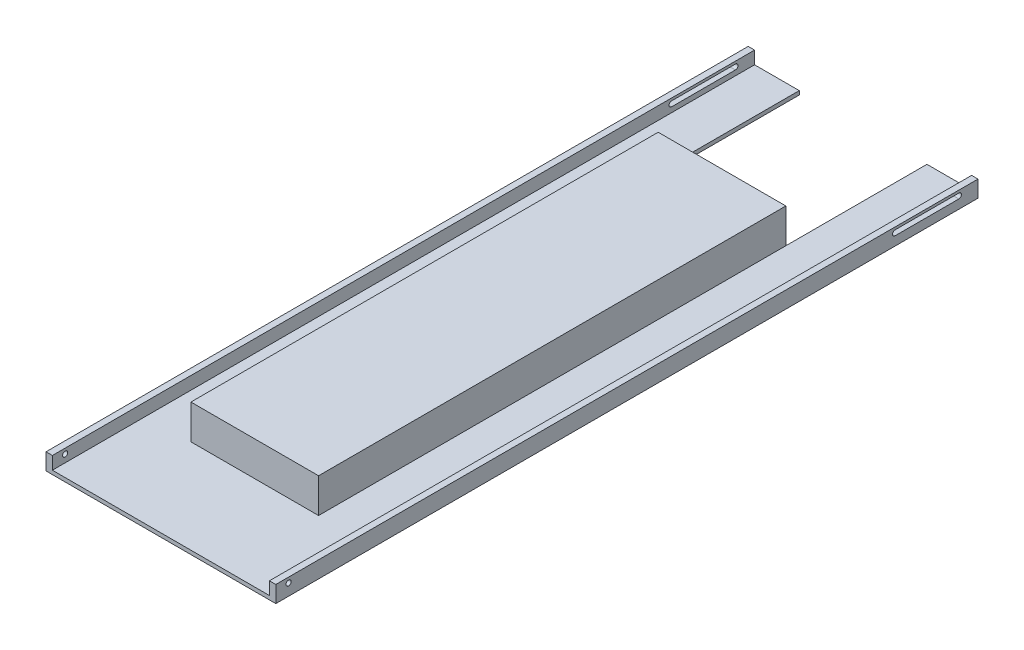
ISO-10303-21;
HEADER;
FILE_DESCRIPTION(('STEP AP214'),'2;1');
FILE_NAME('part.step','',(''),(''),'','','');
FILE_SCHEMA(('AUTOMOTIVE_DESIGN { 1 0 10303 214 1 1 1 1 }'));
ENDSEC;
DATA;
#1=APPLICATION_CONTEXT('core data for automotive mechanical design processes');
#2=APPLICATION_PROTOCOL_DEFINITION('international standard','automotive_design',2000,#1);
#3=PRODUCT_CONTEXT('',#1,'mechanical');
#4=PRODUCT('Part','Part','',(#3));
#5=PRODUCT_RELATED_PRODUCT_CATEGORY('part','',(#4));
#6=PRODUCT_DEFINITION_FORMATION('','',#4);
#7=PRODUCT_DEFINITION_CONTEXT('part definition',#1,'design');
#8=PRODUCT_DEFINITION('design','',#6,#7);
#9=PRODUCT_DEFINITION_SHAPE('','',#8);
#10=(LENGTH_UNIT() NAMED_UNIT(*) SI_UNIT(.MILLI.,.METRE.));
#11=(NAMED_UNIT(*) PLANE_ANGLE_UNIT() SI_UNIT($,.RADIAN.));
#12=(NAMED_UNIT(*) SI_UNIT($,.STERADIAN.) SOLID_ANGLE_UNIT());
#13=UNCERTAINTY_MEASURE_WITH_UNIT(LENGTH_MEASURE(1.E-05),#10,'distance_accuracy_value','');
#14=(GEOMETRIC_REPRESENTATION_CONTEXT(3) GLOBAL_UNCERTAINTY_ASSIGNED_CONTEXT((#13)) GLOBAL_UNIT_ASSIGNED_CONTEXT((#10,
#11,#12)) REPRESENTATION_CONTEXT('',''));
#15=CARTESIAN_POINT('',(0.,0.,0.));
#16=DIRECTION('',(0.,0.,1.));
#17=DIRECTION('',(1.,0.,0.));
#18=AXIS2_PLACEMENT_3D('',#15,#16,#17);
#19=CARTESIAN_POINT('',(-25.6470588235294,7.85294117647059,474.5));
#20=DIRECTION('',(0.,0.,1.));
#21=DIRECTION('',(1.,0.,0.));
#22=AXIS2_PLACEMENT_3D('',#19,#20,#21);
#23=PLANE('',#22);
#24=DIRECTION('',(0.,1.,0.));
#25=VECTOR('',#24,1.);
#26=CARTESIAN_POINT('',(-27.6470588235294,-9.14705882352941,474.5));
#27=LINE('',#26,#25);
#28=CARTESIAN_POINT('',(-27.6470588235294,-9.14705882352941,474.5));
#29=VERTEX_POINT('',#28);
#30=CARTESIAN_POINT('',(-27.6470588235294,18.8529411764706,474.5));
#31=VERTEX_POINT('',#30);
#32=EDGE_CURVE('E246',#29,#31,#27,.T.);
#33=ORIENTED_EDGE('',*,*,#32,.F.);
#34=DIRECTION('',(1.,0.,0.));
#35=VECTOR('',#34,1.);
#36=CARTESIAN_POINT('',(-125.647058823529,-9.14705882352941,474.5));
#37=LINE('',#36,#35);
#38=CARTESIAN_POINT('',(-123.647058823529,-9.14705882352941,474.5));
#39=VERTEX_POINT('',#38);
#40=EDGE_CURVE('E234',#39,#29,#37,.T.);
#41=ORIENTED_EDGE('',*,*,#40,.F.);
#42=DIRECTION('',(0.,-1.,0.));
#43=VECTOR('',#42,1.);
#44=CARTESIAN_POINT('',(-123.647058823529,-9.14705882352941,474.5));
#45=LINE('',#44,#43);
#46=CARTESIAN_POINT('',(-123.647058823529,18.8529411764706,474.5));
#47=VERTEX_POINT('',#46);
#48=EDGE_CURVE('E245',#47,#39,#45,.T.);
#49=ORIENTED_EDGE('',*,*,#48,.F.);
#50=DIRECTION('',(-1.,0.,0.));
#51=VECTOR('',#50,1.);
#52=CARTESIAN_POINT('',(-125.647058823529,18.8529411764706,474.5));
#53=LINE('',#52,#51);
#54=EDGE_CURVE('E375',#31,#47,#53,.T.);
#55=ORIENTED_EDGE('',*,*,#54,.F.);
#56=EDGE_LOOP('',(#33,#41,#49,#55));
#57=FACE_BOUND('',#56,.T.);
#58=ADVANCED_FACE('F39',(#57),#23,.F.);
#59=CARTESIAN_POINT('',(-125.647058823529,18.8529411764706,110.5));
#60=DIRECTION('',(0.,1.,0.));
#61=DIRECTION('',(-1.,0.,0.));
#62=AXIS2_PLACEMENT_3D('',#59,#60,#61);
#63=PLANE('',#62);
#64=DIRECTION('',(0.,0.,1.));
#65=VECTOR('',#64,1.);
#66=CARTESIAN_POINT('',(-27.6470588235294,18.8529411764706,82.4286623047636));
#67=LINE('',#66,#65);
#68=CARTESIAN_POINT('',(-27.6470588235294,18.8529411764706,110.5));
#69=VERTEX_POINT('',#68);
#70=EDGE_CURVE('E55',#69,#31,#67,.T.);
#71=ORIENTED_EDGE('',*,*,#70,.T.);
#72=ORIENTED_EDGE('',*,*,#54,.T.);
#73=DIRECTION('',(0.,0.,1.));
#74=VECTOR('',#73,1.);
#75=CARTESIAN_POINT('',(-123.647058823529,18.8529411764706,82.4286623047636));
#76=LINE('',#75,#74);
#77=CARTESIAN_POINT('',(-123.647058823529,18.8529411764706,110.5));
#78=VERTEX_POINT('',#77);
#79=EDGE_CURVE('E267',#78,#47,#76,.T.);
#80=ORIENTED_EDGE('',*,*,#79,.F.);
#81=DIRECTION('',(-1.,0.,0.));
#82=VECTOR('',#81,1.);
#83=CARTESIAN_POINT('',(-125.647058823529,18.8529411764706,110.5));
#84=LINE('',#83,#82);
#85=EDGE_CURVE('E60',#69,#78,#84,.T.);
#86=ORIENTED_EDGE('',*,*,#85,.F.);
#87=EDGE_LOOP('',(#71,#72,#80,#86));
#88=FACE_BOUND('',#87,.T.);
#89=ADVANCED_FACE('F559',(#88),#63,.F.);
#90=CARTESIAN_POINT('',(-25.6470588235294,7.85294117647059,474.5));
#91=DIRECTION('',(1.,0.,0.));
#92=DIRECTION('',(0.,0.,-1.));
#93=AXIS2_PLACEMENT_3D('',#90,#91,#92);
#94=PLANE('',#93);
#95=DIRECTION('',(0.,1.,0.));
#96=VECTOR('',#95,1.);
#97=CARTESIAN_POINT('',(-25.6470588235294,-9.14705882352941,110.5));
#98=LINE('',#97,#96);
#99=CARTESIAN_POINT('',(-25.6470588235294,-9.14705882352941,110.5));
#100=VERTEX_POINT('',#99);
#101=CARTESIAN_POINT('',(-25.6470588235294,-6.14705882352945,110.5));
#102=VERTEX_POINT('',#101);
#103=EDGE_CURVE('E225',#100,#102,#98,.T.);
#104=ORIENTED_EDGE('',*,*,#103,.T.);
#105=DIRECTION('',(0.,0.,-1.));
#106=VECTOR('',#105,1.);
#107=CARTESIAN_POINT('',(-25.6470588235294,-6.14705882352941,550.));
#108=LINE('',#107,#106);
#109=CARTESIAN_POINT('',(-25.6470588235294,-6.14705882352941,0.));
#110=VERTEX_POINT('',#109);
#111=EDGE_CURVE('E300',#102,#110,#108,.T.);
#112=ORIENTED_EDGE('',*,*,#111,.T.);
#113=DIRECTION('',(0.,1.,0.));
#114=VECTOR('',#113,1.);
#115=CARTESIAN_POINT('',(-25.6470588235294,0.,0.));
#116=LINE('',#115,#114);
#117=CARTESIAN_POINT('',(-25.6470588235294,-9.14705882352941,0.));
#118=VERTEX_POINT('',#117);
#119=EDGE_CURVE('E354',#118,#110,#116,.T.);
#120=ORIENTED_EDGE('',*,*,#119,.F.);
#121=DIRECTION('',(0.,0.,-1.));
#122=VECTOR('',#121,1.);
#123=CARTESIAN_POINT('',(-25.6470588235294,-9.14705882352941,474.5));
#124=LINE('',#123,#122);
#125=EDGE_CURVE('E319',#100,#118,#124,.T.);
#126=ORIENTED_EDGE('',*,*,#125,.F.);
#127=EDGE_LOOP('',(#104,#112,#120,#126));
#128=FACE_BOUND('',#127,.T.);
#129=ADVANCED_FACE('F551',(#128),#94,.F.);
#130=CARTESIAN_POINT('',(-125.647058823529,7.85294117647059,474.5));
#131=DIRECTION('',(-1.,0.,0.));
#132=DIRECTION('',(0.,0.,1.));
#133=AXIS2_PLACEMENT_3D('',#130,#131,#132);
#134=PLANE('',#133);
#135=DIRECTION('',(0.,-1.,0.));
#136=VECTOR('',#135,1.);
#137=CARTESIAN_POINT('',(-125.647058823529,-9.14705882352941,110.5));
#138=LINE('',#137,#136);
#139=CARTESIAN_POINT('',(-125.647058823529,-6.14705882352944,110.5));
#140=VERTEX_POINT('',#139);
#141=CARTESIAN_POINT('',(-125.647058823529,-9.14705882352941,110.5));
#142=VERTEX_POINT('',#141);
#143=EDGE_CURVE('E255',#140,#142,#138,.T.);
#144=ORIENTED_EDGE('',*,*,#143,.T.);
#145=DIRECTION('',(0.,0.,1.));
#146=VECTOR('',#145,1.);
#147=CARTESIAN_POINT('',(-125.647058823529,-9.14705882352941,0.));
#148=LINE('',#147,#146);
#149=CARTESIAN_POINT('',(-125.647058823529,-9.14705882352941,0.));
#150=VERTEX_POINT('',#149);
#151=EDGE_CURVE('E313',#150,#142,#148,.T.);
#152=ORIENTED_EDGE('',*,*,#151,.F.);
#153=DIRECTION('',(0.,-1.,0.));
#154=VECTOR('',#153,1.);
#155=CARTESIAN_POINT('',(-125.647058823529,0.,0.));
#156=LINE('',#155,#154);
#157=CARTESIAN_POINT('',(-125.647058823529,-6.14705882352944,0.));
#158=VERTEX_POINT('',#157);
#159=EDGE_CURVE('E372',#158,#150,#156,.T.);
#160=ORIENTED_EDGE('',*,*,#159,.F.);
#161=DIRECTION('',(0.,0.,-1.));
#162=VECTOR('',#161,1.);
#163=CARTESIAN_POINT('',(-125.647058823529,-6.14705882352944,550.));
#164=LINE('',#163,#162);
#165=EDGE_CURVE('E282',#140,#158,#164,.T.);
#166=ORIENTED_EDGE('',*,*,#165,.F.);
#167=EDGE_LOOP('',(#144,#152,#160,#166));
#168=FACE_BOUND('',#167,.T.);
#169=ADVANCED_FACE('F541',(#168),#134,.F.);
#170=CARTESIAN_POINT('',(9.35294117647058,-2.14705882352941,550.));
#171=DIRECTION('',(0.,-1.,0.));
#172=DIRECTION('',(1.,0.,0.));
#173=AXIS2_PLACEMENT_3D('',#170,#171,#172);
#174=PLANE('',#173);
#175=DIRECTION('',(1.,0.,0.));
#176=VECTOR('',#175,1.);
#177=CARTESIAN_POINT('',(-165.647058823529,-2.14705882352942,65.));
#178=LINE('',#177,#176);
#179=CARTESIAN_POINT('',(-165.647058823529,-2.14705882352942,65.));
#180=VERTEX_POINT('',#179);
#181=CARTESIAN_POINT('',(-160.647058823529,-2.14705882352943,65.));
#182=VERTEX_POINT('',#181);
#183=EDGE_CURVE('E456',#180,#182,#178,.T.);
#184=ORIENTED_EDGE('',*,*,#183,.T.);
#185=DIRECTION('',(0.,0.,-1.));
#186=VECTOR('',#185,1.);
#187=CARTESIAN_POINT('',(-160.647058823529,-2.14705882352943,550.));
#188=LINE('',#187,#186);
#189=CARTESIAN_POINT('',(-160.647058823529,-2.14705882352943,15.));
#190=VERTEX_POINT('',#189);
#191=EDGE_CURVE('E334',#182,#190,#188,.T.);
#192=ORIENTED_EDGE('',*,*,#191,.T.);
#193=DIRECTION('',(1.,0.,0.));
#194=VECTOR('',#193,1.);
#195=CARTESIAN_POINT('',(-165.647058823529,-2.14705882352941,15.));
#196=LINE('',#195,#194);
#197=CARTESIAN_POINT('',(-165.647058823529,-2.14705882352941,15.));
#198=VERTEX_POINT('',#197);
#199=EDGE_CURVE('E451',#198,#190,#196,.T.);
#200=ORIENTED_EDGE('',*,*,#199,.F.);
#201=DIRECTION('',(0.,0.,-1.));
#202=VECTOR('',#201,1.);
#203=CARTESIAN_POINT('',(-165.647058823529,-2.14705882352941,15.));
#204=LINE('',#203,#202);
#205=EDGE_CURVE('E413',#180,#198,#204,.T.);
#206=ORIENTED_EDGE('',*,*,#205,.F.);
#207=EDGE_LOOP('',(#184,#192,#200,#206));
#208=FACE_BOUND('',#207,.T.);
#209=ADVANCED_FACE('F538',(#208),#174,.F.);
#210=CARTESIAN_POINT('',(0.,0.,0.));
#211=DIRECTION('',(0.,0.,1.));
#212=DIRECTION('',(1.,0.,0.));
#213=AXIS2_PLACEMENT_3D('',#210,#211,#212);
#214=PLANE('',#213);
#215=DIRECTION('',(0.,1.,0.));
#216=VECTOR('',#215,1.);
#217=CARTESIAN_POINT('',(-160.647058823529,-2.14705882352943,0.));
#218=LINE('',#217,#216);
#219=CARTESIAN_POINT('',(-160.647058823529,-6.14705882352943,0.));
#220=VERTEX_POINT('',#219);
#221=CARTESIAN_POINT('',(-160.647058823529,3.85294117647057,0.));
#222=VERTEX_POINT('',#221);
#223=EDGE_CURVE('E489',#220,#222,#218,.T.);
#224=ORIENTED_EDGE('',*,*,#223,.F.);
#225=DIRECTION('',(-1.,0.,0.));
#226=VECTOR('',#225,1.);
#227=CARTESIAN_POINT('',(-160.647058823529,-6.14705882352943,0.));
#228=LINE('',#227,#226);
#229=EDGE_CURVE('E283',#158,#220,#228,.T.);
#230=ORIENTED_EDGE('',*,*,#229,.F.);
#231=ORIENTED_EDGE('',*,*,#159,.T.);
#232=DIRECTION('',(1.,0.,0.));
#233=VECTOR('',#232,1.);
#234=CARTESIAN_POINT('',(-165.647058823529,-9.14705882352941,0.));
#235=LINE('',#234,#233);
#236=CARTESIAN_POINT('',(-165.647058823529,-9.14705882352941,0.));
#237=VERTEX_POINT('',#236);
#238=EDGE_CURVE('E309',#237,#150,#235,.T.);
#239=ORIENTED_EDGE('',*,*,#238,.F.);
#240=DIRECTION('',(0.,-1.,0.));
#241=VECTOR('',#240,1.);
#242=CARTESIAN_POINT('',(-165.647058823529,7.85294117647057,0.));
#243=LINE('',#242,#241);
#244=CARTESIAN_POINT('',(-165.647058823529,3.85294117647057,0.));
#245=VERTEX_POINT('',#244);
#246=EDGE_CURVE('E484',#245,#237,#243,.T.);
#247=ORIENTED_EDGE('',*,*,#246,.F.);
#248=DIRECTION('',(-1.,0.,0.));
#249=VECTOR('',#248,1.);
#250=CARTESIAN_POINT('',(-165.647058823529,3.85294117647057,0.));
#251=LINE('',#250,#249);
#252=EDGE_CURVE('E338',#222,#245,#251,.T.);
#253=ORIENTED_EDGE('',*,*,#252,.F.);
#254=EDGE_LOOP('',(#224,#230,#231,#239,#247,#253));
#255=FACE_BOUND('',#254,.T.);
#256=ADVANCED_FACE('F540',(#255),#214,.F.);
#257=CARTESIAN_POINT('',(9.35294117647059,-2.14705882352941,15.));
#258=VERTEX_POINT('',#257);
#259=CARTESIAN_POINT('',(14.3529411764706,-2.14705882352941,15.));
#260=VERTEX_POINT('',#259);
#261=EDGE_CURVE('E455',#258,#260,#196,.T.);
#262=ORIENTED_EDGE('',*,*,#261,.F.);
#263=DIRECTION('',(0.,0.,-1.));
#264=VECTOR('',#263,1.);
#265=CARTESIAN_POINT('',(9.35294117647058,-2.14705882352941,550.));
#266=LINE('',#265,#264);
#267=CARTESIAN_POINT('',(9.35294117647059,-2.14705882352941,65.));
#268=VERTEX_POINT('',#267);
#269=EDGE_CURVE('E335',#268,#258,#266,.T.);
#270=ORIENTED_EDGE('',*,*,#269,.F.);
#271=CARTESIAN_POINT('',(14.3529411764706,-2.14705882352942,65.));
#272=VERTEX_POINT('',#271);
#273=EDGE_CURVE('E426',#268,#272,#178,.T.);
#274=ORIENTED_EDGE('',*,*,#273,.T.);
#275=DIRECTION('',(0.,0.,-1.));
#276=VECTOR('',#275,1.);
#277=CARTESIAN_POINT('',(14.3529411764706,-2.14705882352941,15.));
#278=LINE('',#277,#276);
#279=EDGE_CURVE('E429',#272,#260,#278,.T.);
#280=ORIENTED_EDGE('',*,*,#279,.T.);
#281=EDGE_LOOP('',(#262,#270,#274,#280));
#282=FACE_BOUND('',#281,.T.);
#283=ADVANCED_FACE('F543',(#282),#174,.F.);
#284=CARTESIAN_POINT('',(-165.647058823529,7.85294117647057,550.));
#285=DIRECTION('',(1.,0.,0.));
#286=DIRECTION('',(0.,0.,-1.));
#287=AXIS2_PLACEMENT_3D('',#284,#285,#286);
#288=PLANE('',#287);
#289=DIRECTION('',(0.,0.,1.));
#290=VECTOR('',#289,1.);
#291=CARTESIAN_POINT('',(-165.647058823529,1.85294117647059,65.));
#292=LINE('',#291,#290);
#293=CARTESIAN_POINT('',(-165.647058823529,1.85294117647059,15.));
#294=VERTEX_POINT('',#293);
#295=CARTESIAN_POINT('',(-165.647058823529,1.85294117647059,65.));
#296=VERTEX_POINT('',#295);
#297=EDGE_CURVE('E422',#294,#296,#292,.T.);
#298=ORIENTED_EDGE('',*,*,#297,.T.);
#299=CARTESIAN_POINT('',(-165.647058823529,-0.14705882352941,65.));
#300=DIRECTION('',(1.,0.,0.));
#301=DIRECTION('',(0.,0.,-1.));
#302=AXIS2_PLACEMENT_3D('',#299,#300,#301);
#303=CIRCLE('',#302,2.);
#304=EDGE_CURVE('E409',#296,#180,#303,.T.);
#305=ORIENTED_EDGE('',*,*,#304,.T.);
#306=ORIENTED_EDGE('',*,*,#205,.T.);
#307=CARTESIAN_POINT('',(-165.647058823529,-0.14705882352941,15.));
#308=DIRECTION('',(1.,0.,0.));
#309=DIRECTION('',(0.,0.,-1.));
#310=AXIS2_PLACEMENT_3D('',#307,#308,#309);
#311=CIRCLE('',#310,2.);
#312=EDGE_CURVE('E418',#198,#294,#311,.T.);
#313=ORIENTED_EDGE('',*,*,#312,.T.);
#314=EDGE_LOOP('',(#298,#305,#306,#313));
#315=FACE_BOUND('',#314,.T.);
#316=CARTESIAN_POINT('',(-165.647058823529,-0.147058823529409,540.));
#317=DIRECTION('',(1.,0.,0.));
#318=DIRECTION('',(0.,0.,-1.));
#319=AXIS2_PLACEMENT_3D('',#316,#317,#318);
#320=CIRCLE('',#319,1.99999999999996);
#321=CARTESIAN_POINT('',(-165.647058823529,-0.147058823529409,538.));
#322=VERTEX_POINT('',#321);
#323=EDGE_CURVE('E475',#322,#322,#320,.T.);
#324=ORIENTED_EDGE('',*,*,#323,.T.);
#325=EDGE_LOOP('',(#324));
#326=FACE_BOUND('',#325,.T.);
#327=DIRECTION('',(0.,-1.,0.));
#328=VECTOR('',#327,1.);
#329=CARTESIAN_POINT('',(-165.647058823529,7.85294117647057,550.));
#330=LINE('',#329,#328);
#331=CARTESIAN_POINT('',(-165.647058823529,3.85294117647057,550.));
#332=VERTEX_POINT('',#331);
#333=CARTESIAN_POINT('',(-165.647058823529,-9.14705882352941,550.));
#334=VERTEX_POINT('',#333);
#335=EDGE_CURVE('E485',#332,#334,#330,.T.);
#336=ORIENTED_EDGE('',*,*,#335,.F.);
#337=DIRECTION('',(0.,0.,-1.));
#338=VECTOR('',#337,1.);
#339=CARTESIAN_POINT('',(-165.647058823529,3.85294117647057,550.));
#340=LINE('',#339,#338);
#341=EDGE_CURVE('E349',#332,#245,#340,.T.);
#342=ORIENTED_EDGE('',*,*,#341,.T.);
#343=ORIENTED_EDGE('',*,*,#246,.T.);
#344=DIRECTION('',(0.,0.,-1.));
#345=VECTOR('',#344,1.);
#346=CARTESIAN_POINT('',(-165.647058823529,-9.14705882352941,550.));
#347=LINE('',#346,#345);
#348=EDGE_CURVE('E292',#334,#237,#347,.T.);
#349=ORIENTED_EDGE('',*,*,#348,.F.);
#350=EDGE_LOOP('',(#336,#342,#343,#349));
#351=FACE_BOUND('',#350,.T.);
#352=ADVANCED_FACE('F41',(#315,#326,#351),#288,.F.);
#353=CARTESIAN_POINT('',(14.3529411764706,-7.14705882352941,550.));
#354=DIRECTION('',(-1.,0.,0.));
#355=DIRECTION('',(0.,0.,1.));
#356=AXIS2_PLACEMENT_3D('',#353,#354,#355);
#357=PLANE('',#356);
#358=ORIENTED_EDGE('',*,*,#279,.F.);
#359=CARTESIAN_POINT('',(14.3529411764706,-0.14705882352941,65.));
#360=DIRECTION('',(1.,0.,0.));
#361=DIRECTION('',(0.,0.,-1.));
#362=AXIS2_PLACEMENT_3D('',#359,#360,#361);
#363=CIRCLE('',#362,2.);
#364=CARTESIAN_POINT('',(14.3529411764706,1.85294117647059,65.));
#365=VERTEX_POINT('',#364);
#366=EDGE_CURVE('E408',#365,#272,#363,.T.);
#367=ORIENTED_EDGE('',*,*,#366,.F.);
#368=DIRECTION('',(0.,0.,1.));
#369=VECTOR('',#368,1.);
#370=CARTESIAN_POINT('',(14.3529411764706,1.85294117647059,65.));
#371=LINE('',#370,#369);
#372=CARTESIAN_POINT('',(14.3529411764706,1.85294117647059,15.));
#373=VERTEX_POINT('',#372);
#374=EDGE_CURVE('E414',#373,#365,#371,.T.);
#375=ORIENTED_EDGE('',*,*,#374,.F.);
#376=CARTESIAN_POINT('',(14.3529411764706,-0.14705882352941,15.));
#377=DIRECTION('',(1.,0.,0.));
#378=DIRECTION('',(0.,0.,-1.));
#379=AXIS2_PLACEMENT_3D('',#376,#377,#378);
#380=CIRCLE('',#379,2.);
#381=EDGE_CURVE('E433',#260,#373,#380,.T.);
#382=ORIENTED_EDGE('',*,*,#381,.F.);
#383=EDGE_LOOP('',(#358,#367,#375,#382));
#384=FACE_BOUND('',#383,.T.);
#385=CARTESIAN_POINT('',(14.3529411764706,-0.147058823529409,540.));
#386=DIRECTION('',(1.,0.,0.));
#387=DIRECTION('',(0.,0.,-1.));
#388=AXIS2_PLACEMENT_3D('',#385,#386,#387);
#389=CIRCLE('',#388,1.99999999999998);
#390=CARTESIAN_POINT('',(14.3529411764706,-0.147058823529409,538.));
#391=VERTEX_POINT('',#390);
#392=EDGE_CURVE('E471',#391,#391,#389,.T.);
#393=ORIENTED_EDGE('',*,*,#392,.F.);
#394=EDGE_LOOP('',(#393));
#395=FACE_BOUND('',#394,.T.);
#396=DIRECTION('',(0.,1.,0.));
#397=VECTOR('',#396,1.);
#398=CARTESIAN_POINT('',(14.3529411764706,-7.14705882352941,0.));
#399=LINE('',#398,#397);
#400=CARTESIAN_POINT('',(14.3529411764706,-9.14705882352941,0.));
#401=VERTEX_POINT('',#400);
#402=CARTESIAN_POINT('',(14.3529411764706,3.85294117647059,0.));
#403=VERTEX_POINT('',#402);
#404=EDGE_CURVE('E504',#401,#403,#399,.T.);
#405=ORIENTED_EDGE('',*,*,#404,.T.);
#406=DIRECTION('',(0.,0.,-1.));
#407=VECTOR('',#406,1.);
#408=CARTESIAN_POINT('',(14.3529411764706,3.85294117647059,550.));
#409=LINE('',#408,#407);
#410=CARTESIAN_POINT('',(14.3529411764706,3.85294117647059,550.));
#411=VERTEX_POINT('',#410);
#412=EDGE_CURVE('E345',#411,#403,#409,.T.);
#413=ORIENTED_EDGE('',*,*,#412,.F.);
#414=DIRECTION('',(0.,1.,0.));
#415=VECTOR('',#414,1.);
#416=CARTESIAN_POINT('',(14.3529411764706,-7.14705882352941,550.));
#417=LINE('',#416,#415);
#418=CARTESIAN_POINT('',(14.3529411764706,-9.14705882352941,550.));
#419=VERTEX_POINT('',#418);
#420=EDGE_CURVE('E488',#419,#411,#417,.T.);
#421=ORIENTED_EDGE('',*,*,#420,.F.);
#422=DIRECTION('',(0.,0.,1.));
#423=VECTOR('',#422,1.);
#424=CARTESIAN_POINT('',(14.3529411764706,-9.14705882352941,0.));
#425=LINE('',#424,#423);
#426=EDGE_CURVE('E326',#401,#419,#425,.T.);
#427=ORIENTED_EDGE('',*,*,#426,.F.);
#428=EDGE_LOOP('',(#405,#413,#421,#427));
#429=FACE_BOUND('',#428,.T.);
#430=ADVANCED_FACE('F601',(#384,#395,#429),#357,.F.);
#431=CARTESIAN_POINT('',(9.35294117647058,7.85294117647059,550.));
#432=DIRECTION('',(1.,0.,0.));
#433=DIRECTION('',(0.,1.,0.));
#434=AXIS2_PLACEMENT_3D('',#431,#432,#433);
#435=PLANE('',#434);
#436=DIRECTION('',(0.,-1.,0.));
#437=VECTOR('',#436,1.);
#438=CARTESIAN_POINT('',(9.35294117647058,7.85294117647059,0.));
#439=LINE('',#438,#437);
#440=CARTESIAN_POINT('',(9.35294117647058,3.85294117647059,0.));
#441=VERTEX_POINT('',#440);
#442=CARTESIAN_POINT('',(9.35294117647058,-6.14705882352941,0.));
#443=VERTEX_POINT('',#442);
#444=EDGE_CURVE('E508',#441,#443,#439,.T.);
#445=ORIENTED_EDGE('',*,*,#444,.T.);
#446=DIRECTION('',(0.,0.,-1.));
#447=VECTOR('',#446,1.);
#448=CARTESIAN_POINT('',(9.35294117647058,-6.14705882352941,550.));
#449=LINE('',#448,#447);
#450=CARTESIAN_POINT('',(9.35294117647058,-6.14705882352941,550.));
#451=VERTEX_POINT('',#450);
#452=EDGE_CURVE('E299',#451,#443,#449,.T.);
#453=ORIENTED_EDGE('',*,*,#452,.F.);
#454=DIRECTION('',(0.,-1.,0.));
#455=VECTOR('',#454,1.);
#456=CARTESIAN_POINT('',(9.35294117647058,7.85294117647059,550.));
#457=LINE('',#456,#455);
#458=CARTESIAN_POINT('',(9.35294117647058,3.85294117647059,550.));
#459=VERTEX_POINT('',#458);
#460=EDGE_CURVE('E493',#459,#451,#457,.T.);
#461=ORIENTED_EDGE('',*,*,#460,.F.);
#462=DIRECTION('',(0.,0.,-1.));
#463=VECTOR('',#462,1.);
#464=CARTESIAN_POINT('',(9.35294117647058,3.85294117647059,550.));
#465=LINE('',#464,#463);
#466=EDGE_CURVE('E350',#459,#441,#465,.T.);
#467=ORIENTED_EDGE('',*,*,#466,.T.);
#468=EDGE_LOOP('',(#445,#453,#461,#467));
#469=FACE_BOUND('',#468,.T.);
#470=CARTESIAN_POINT('',(9.35294117647056,-0.14705882352941,65.));
#471=DIRECTION('',(1.,0.,0.));
#472=DIRECTION('',(0.,1.,0.));
#473=AXIS2_PLACEMENT_3D('',#470,#471,#472);
#474=CIRCLE('',#473,2.);
#475=CARTESIAN_POINT('',(9.35294117647054,1.85294117647059,65.));
#476=VERTEX_POINT('',#475);
#477=EDGE_CURVE('E467',#476,#268,#474,.T.);
#478=ORIENTED_EDGE('',*,*,#477,.T.);
#479=ORIENTED_EDGE('',*,*,#269,.T.);
#480=CARTESIAN_POINT('',(9.35294117647056,-0.14705882352941,15.));
#481=DIRECTION('',(1.,0.,0.));
#482=DIRECTION('',(0.,1.,0.));
#483=AXIS2_PLACEMENT_3D('',#480,#481,#482);
#484=CIRCLE('',#483,2.);
#485=CARTESIAN_POINT('',(9.35294117647051,1.85294117647059,15.));
#486=VERTEX_POINT('',#485);
#487=EDGE_CURVE('E444',#258,#486,#484,.T.);
#488=ORIENTED_EDGE('',*,*,#487,.T.);
#489=DIRECTION('',(0.,0.,1.));
#490=VECTOR('',#489,1.);
#491=CARTESIAN_POINT('',(9.35294117647058,1.85294117647059,550.));
#492=LINE('',#491,#490);
#493=EDGE_CURVE('E463',#486,#476,#492,.T.);
#494=ORIENTED_EDGE('',*,*,#493,.T.);
#495=EDGE_LOOP('',(#478,#479,#488,#494));
#496=FACE_BOUND('',#495,.T.);
#497=CARTESIAN_POINT('',(9.35294117647058,-0.147058823529409,540.));
#498=DIRECTION('',(1.,0.,0.));
#499=DIRECTION('',(0.,1.,0.));
#500=AXIS2_PLACEMENT_3D('',#497,#498,#499);
#501=CIRCLE('',#500,1.99999999999997);
#502=CARTESIAN_POINT('',(9.35294117647058,1.85294117647056,540.));
#503=VERTEX_POINT('',#502);
#504=EDGE_CURVE('E479',#503,#503,#501,.T.);
#505=ORIENTED_EDGE('',*,*,#504,.T.);
#506=EDGE_LOOP('',(#505));
#507=FACE_BOUND('',#506,.T.);
#508=ADVANCED_FACE('F596',(#469,#496,#507),#435,.F.);
#509=CARTESIAN_POINT('',(-160.647058823529,-2.14705882352943,550.));
#510=DIRECTION('',(-1.,0.,0.));
#511=DIRECTION('',(0.,0.,1.));
#512=AXIS2_PLACEMENT_3D('',#509,#510,#511);
#513=PLANE('',#512);
#514=CARTESIAN_POINT('',(-160.647058823529,-0.147058823529409,540.));
#515=DIRECTION('',(-1.,0.,0.));
#516=DIRECTION('',(0.,0.,1.));
#517=AXIS2_PLACEMENT_3D('',#514,#515,#516);
#518=CIRCLE('',#517,1.99999999999997);
#519=CARTESIAN_POINT('',(-160.647058823529,-0.147058823529409,542.));
#520=VERTEX_POINT('',#519);
#521=EDGE_CURVE('E480',#520,#520,#518,.T.);
#522=ORIENTED_EDGE('',*,*,#521,.T.);
#523=EDGE_LOOP('',(#522));
#524=FACE_BOUND('',#523,.T.);
#525=ORIENTED_EDGE('',*,*,#191,.F.);
#526=CARTESIAN_POINT('',(-160.647058823529,-0.14705882352941,65.));
#527=DIRECTION('',(-1.,0.,0.));
#528=DIRECTION('',(0.,0.,1.));
#529=AXIS2_PLACEMENT_3D('',#526,#527,#528);
#530=CIRCLE('',#529,2.);
#531=CARTESIAN_POINT('',(-160.647058823529,1.85294117647059,65.));
#532=VERTEX_POINT('',#531);
#533=EDGE_CURVE('E11',#182,#532,#530,.T.);
#534=ORIENTED_EDGE('',*,*,#533,.T.);
#535=DIRECTION('',(0.,0.,-1.));
#536=VECTOR('',#535,1.);
#537=CARTESIAN_POINT('',(-160.647058823529,1.85294117647059,550.));
#538=LINE('',#537,#536);
#539=CARTESIAN_POINT('',(-160.647058823529,1.85294117647059,15.));
#540=VERTEX_POINT('',#539);
#541=EDGE_CURVE('E48',#532,#540,#538,.T.);
#542=ORIENTED_EDGE('',*,*,#541,.T.);
#543=CARTESIAN_POINT('',(-160.647058823529,-0.14705882352941,15.));
#544=DIRECTION('',(-1.,0.,0.));
#545=DIRECTION('',(0.,0.,1.));
#546=AXIS2_PLACEMENT_3D('',#543,#544,#545);
#547=CIRCLE('',#546,2.);
#548=EDGE_CURVE('E501',#540,#190,#547,.T.);
#549=ORIENTED_EDGE('',*,*,#548,.T.);
#550=EDGE_LOOP('',(#525,#534,#542,#549));
#551=FACE_BOUND('',#550,.T.);
#552=ORIENTED_EDGE('',*,*,#223,.T.);
#553=DIRECTION('',(0.,0.,-1.));
#554=VECTOR('',#553,1.);
#555=CARTESIAN_POINT('',(-160.647058823529,3.85294117647057,550.));
#556=LINE('',#555,#554);
#557=CARTESIAN_POINT('',(-160.647058823529,3.85294117647057,550.));
#558=VERTEX_POINT('',#557);
#559=EDGE_CURVE('E361',#558,#222,#556,.T.);
#560=ORIENTED_EDGE('',*,*,#559,.F.);
#561=DIRECTION('',(0.,1.,0.));
#562=VECTOR('',#561,1.);
#563=CARTESIAN_POINT('',(-160.647058823529,-2.14705882352943,550.));
#564=LINE('',#563,#562);
#565=CARTESIAN_POINT('',(-160.647058823529,-6.14705882352943,550.));
#566=VERTEX_POINT('',#565);
#567=EDGE_CURVE('E497',#566,#558,#564,.T.);
#568=ORIENTED_EDGE('',*,*,#567,.F.);
#569=DIRECTION('',(0.,0.,-1.));
#570=VECTOR('',#569,1.);
#571=CARTESIAN_POINT('',(-160.647058823529,-6.14705882352943,550.));
#572=LINE('',#571,#570);
#573=EDGE_CURVE('E288',#566,#220,#572,.T.);
#574=ORIENTED_EDGE('',*,*,#573,.T.);
#575=EDGE_LOOP('',(#552,#560,#568,#574));
#576=FACE_BOUND('',#575,.T.);
#577=ADVANCED_FACE('F522',(#524,#551,#576),#513,.F.);
#578=CARTESIAN_POINT('',(0.,0.,550.));
#579=DIRECTION('',(0.,0.,1.));
#580=DIRECTION('',(1.,0.,0.));
#581=AXIS2_PLACEMENT_3D('',#578,#579,#580);
#582=PLANE('',#581);
#583=ORIENTED_EDGE('',*,*,#460,.T.);
#584=DIRECTION('',(-1.,0.,0.));
#585=VECTOR('',#584,1.);
#586=CARTESIAN_POINT('',(-160.647058823529,-6.14705882352943,550.));
#587=LINE('',#586,#585);
#588=EDGE_CURVE('E278',#451,#566,#587,.T.);
#589=ORIENTED_EDGE('',*,*,#588,.T.);
#590=ORIENTED_EDGE('',*,*,#567,.T.);
#591=DIRECTION('',(-1.,0.,0.));
#592=VECTOR('',#591,1.);
#593=CARTESIAN_POINT('',(-165.647058823529,3.85294117647057,550.));
#594=LINE('',#593,#592);
#595=EDGE_CURVE('E357',#558,#332,#594,.T.);
#596=ORIENTED_EDGE('',*,*,#595,.T.);
#597=ORIENTED_EDGE('',*,*,#335,.T.);
#598=DIRECTION('',(-1.,0.,0.));
#599=VECTOR('',#598,1.);
#600=CARTESIAN_POINT('',(14.3529411764706,-9.14705882352941,550.));
#601=LINE('',#600,#599);
#602=EDGE_CURVE('E330',#419,#334,#601,.T.);
#603=ORIENTED_EDGE('',*,*,#602,.F.);
#604=ORIENTED_EDGE('',*,*,#420,.T.);
#605=DIRECTION('',(-1.,0.,0.));
#606=VECTOR('',#605,1.);
#607=CARTESIAN_POINT('',(9.35294117647058,3.85294117647059,550.));
#608=LINE('',#607,#606);
#609=EDGE_CURVE('E341',#411,#459,#608,.T.);
#610=ORIENTED_EDGE('',*,*,#609,.T.);
#611=EDGE_LOOP('',(#583,#589,#590,#596,#597,#603,#604,#610));
#612=FACE_BOUND('',#611,.T.);
#613=ADVANCED_FACE('F590',(#612),#582,.T.);
#614=ORIENTED_EDGE('',*,*,#119,.T.);
#615=DIRECTION('',(-1.,0.,0.));
#616=VECTOR('',#615,1.);
#617=CARTESIAN_POINT('',(-25.6470588235294,-6.14705882352941,0.));
#618=LINE('',#617,#616);
#619=EDGE_CURVE('E277',#443,#110,#618,.T.);
#620=ORIENTED_EDGE('',*,*,#619,.F.);
#621=ORIENTED_EDGE('',*,*,#444,.F.);
#622=DIRECTION('',(-1.,0.,0.));
#623=VECTOR('',#622,1.);
#624=CARTESIAN_POINT('',(9.35294117647058,3.85294117647059,0.));
#625=LINE('',#624,#623);
#626=EDGE_CURVE('E346',#403,#441,#625,.T.);
#627=ORIENTED_EDGE('',*,*,#626,.F.);
#628=ORIENTED_EDGE('',*,*,#404,.F.);
#629=DIRECTION('',(1.,0.,0.));
#630=VECTOR('',#629,1.);
#631=CARTESIAN_POINT('',(-25.6470588235294,-9.14705882352941,0.));
#632=LINE('',#631,#630);
#633=EDGE_CURVE('E322',#118,#401,#632,.T.);
#634=ORIENTED_EDGE('',*,*,#633,.F.);
#635=EDGE_LOOP('',(#614,#620,#621,#627,#628,#634));
#636=FACE_BOUND('',#635,.T.);
#637=ADVANCED_FACE('F550',(#636),#214,.F.);
#638=CARTESIAN_POINT('',(14.3529411764706,-0.147058823529409,540.));
#639=DIRECTION('',(1.,0.,0.));
#640=DIRECTION('',(0.,0.,-1.));
#641=AXIS2_PLACEMENT_3D('',#638,#639,#640);
#642=CYLINDRICAL_SURFACE('',#641,1.99999999999997);
#643=ORIENTED_EDGE('',*,*,#392,.T.);
#644=EDGE_LOOP('',(#643));
#645=FACE_BOUND('',#644,.T.);
#646=ORIENTED_EDGE('',*,*,#504,.F.);
#647=EDGE_LOOP('',(#646));
#648=FACE_BOUND('',#647,.T.);
#649=ADVANCED_FACE('F588',(#645,#648),#642,.F.);
#650=ORIENTED_EDGE('',*,*,#323,.F.);
#651=EDGE_LOOP('',(#650));
#652=FACE_BOUND('',#651,.T.);
#653=ORIENTED_EDGE('',*,*,#521,.F.);
#654=EDGE_LOOP('',(#653));
#655=FACE_BOUND('',#654,.T.);
#656=ADVANCED_FACE('F585',(#652,#655),#642,.F.);
#657=CARTESIAN_POINT('',(-165.647058823529,-0.14705882352941,15.));
#658=DIRECTION('',(1.,0.,0.));
#659=DIRECTION('',(0.,0.,-1.));
#660=AXIS2_PLACEMENT_3D('',#657,#658,#659);
#661=CYLINDRICAL_SURFACE('',#660,2.);
#662=DIRECTION('',(1.,0.,0.));
#663=VECTOR('',#662,1.);
#664=CARTESIAN_POINT('',(-165.647058823529,1.85294117647059,15.));
#665=LINE('',#664,#663);
#666=EDGE_CURVE('E446',#294,#540,#665,.T.);
#667=ORIENTED_EDGE('',*,*,#666,.F.);
#668=ORIENTED_EDGE('',*,*,#312,.F.);
#669=ORIENTED_EDGE('',*,*,#199,.T.);
#670=ORIENTED_EDGE('',*,*,#548,.F.);
#671=EDGE_LOOP('',(#667,#668,#669,#670));
#672=FACE_BOUND('',#671,.T.);
#673=ADVANCED_FACE('F536',(#672),#661,.F.);
#674=CARTESIAN_POINT('',(-165.647058823529,1.85294117647059,65.));
#675=DIRECTION('',(0.,1.,0.));
#676=DIRECTION('',(0.,0.,1.));
#677=AXIS2_PLACEMENT_3D('',#674,#675,#676);
#678=PLANE('',#677);
#679=DIRECTION('',(1.,0.,0.));
#680=VECTOR('',#679,1.);
#681=CARTESIAN_POINT('',(-165.647058823529,1.85294117647059,65.));
#682=LINE('',#681,#680);
#683=EDGE_CURVE('E440',#296,#532,#682,.T.);
#684=ORIENTED_EDGE('',*,*,#683,.F.);
#685=ORIENTED_EDGE('',*,*,#297,.F.);
#686=ORIENTED_EDGE('',*,*,#666,.T.);
#687=ORIENTED_EDGE('',*,*,#541,.F.);
#688=EDGE_LOOP('',(#684,#685,#686,#687));
#689=FACE_BOUND('',#688,.T.);
#690=ADVANCED_FACE('F526',(#689),#678,.F.);
#691=CARTESIAN_POINT('',(-165.647058823529,-0.14705882352941,65.));
#692=DIRECTION('',(1.,0.,0.));
#693=DIRECTION('',(0.,0.,-1.));
#694=AXIS2_PLACEMENT_3D('',#691,#692,#693);
#695=CYLINDRICAL_SURFACE('',#694,2.);
#696=ORIENTED_EDGE('',*,*,#183,.F.);
#697=ORIENTED_EDGE('',*,*,#304,.F.);
#698=ORIENTED_EDGE('',*,*,#683,.T.);
#699=ORIENTED_EDGE('',*,*,#533,.F.);
#700=EDGE_LOOP('',(#696,#697,#698,#699));
#701=FACE_BOUND('',#700,.T.);
#702=ADVANCED_FACE('F530',(#701),#695,.F.);
#703=EDGE_CURVE('E445',#476,#365,#682,.T.);
#704=ORIENTED_EDGE('',*,*,#703,.T.);
#705=ORIENTED_EDGE('',*,*,#366,.T.);
#706=ORIENTED_EDGE('',*,*,#273,.F.);
#707=ORIENTED_EDGE('',*,*,#477,.F.);
#708=EDGE_LOOP('',(#704,#705,#706,#707));
#709=FACE_BOUND('',#708,.T.);
#710=ADVANCED_FACE('F577',(#709),#695,.F.);
#711=EDGE_CURVE('E450',#486,#373,#665,.T.);
#712=ORIENTED_EDGE('',*,*,#711,.T.);
#713=ORIENTED_EDGE('',*,*,#374,.T.);
#714=ORIENTED_EDGE('',*,*,#703,.F.);
#715=ORIENTED_EDGE('',*,*,#493,.F.);
#716=EDGE_LOOP('',(#712,#713,#714,#715));
#717=FACE_BOUND('',#716,.T.);
#718=ADVANCED_FACE('F573',(#717),#678,.F.);
#719=ORIENTED_EDGE('',*,*,#261,.T.);
#720=ORIENTED_EDGE('',*,*,#381,.T.);
#721=ORIENTED_EDGE('',*,*,#711,.F.);
#722=ORIENTED_EDGE('',*,*,#487,.F.);
#723=EDGE_LOOP('',(#719,#720,#721,#722));
#724=FACE_BOUND('',#723,.T.);
#725=ADVANCED_FACE('F576',(#724),#661,.F.);
#726=CARTESIAN_POINT('',(-125.647058823529,20.8529411764706,474.5));
#727=DIRECTION('',(1.,0.,0.));
#728=DIRECTION('',(0.,0.,-1.));
#729=AXIS2_PLACEMENT_3D('',#726,#727,#728);
#730=PLANE('',#729);
#731=CARTESIAN_POINT('',(-125.647058823529,-6.14705882352944,476.5));
#732=VERTEX_POINT('',#731);
#733=EDGE_CURVE('E293',#732,#140,#164,.T.);
#734=ORIENTED_EDGE('',*,*,#733,.F.);
#735=DIRECTION('',(0.,-1.,0.));
#736=VECTOR('',#735,1.);
#737=CARTESIAN_POINT('',(-125.647058823529,20.8529411764706,476.5));
#738=LINE('',#737,#736);
#739=CARTESIAN_POINT('',(-125.647058823529,20.8529411764706,476.5));
#740=VERTEX_POINT('',#739);
#741=EDGE_CURVE('E404',#740,#732,#738,.T.);
#742=ORIENTED_EDGE('',*,*,#741,.F.);
#743=DIRECTION('',(0.,0.,1.));
#744=VECTOR('',#743,1.);
#745=CARTESIAN_POINT('',(-125.647058823529,20.8529411764706,474.5));
#746=LINE('',#745,#744);
#747=CARTESIAN_POINT('',(-125.647058823529,20.8529411764706,110.5));
#748=VERTEX_POINT('',#747);
#749=EDGE_CURVE('E388',#748,#740,#746,.T.);
#750=ORIENTED_EDGE('',*,*,#749,.F.);
#751=DIRECTION('',(0.,1.,0.));
#752=VECTOR('',#751,1.);
#753=CARTESIAN_POINT('',(-125.647058823529,20.8529411764706,110.5));
#754=LINE('',#753,#752);
#755=EDGE_CURVE('E376',#140,#748,#754,.T.);
#756=ORIENTED_EDGE('',*,*,#755,.F.);
#757=EDGE_LOOP('',(#734,#742,#750,#756));
#758=FACE_BOUND('',#757,.T.);
#759=ADVANCED_FACE('F568',(#758),#730,.F.);
#760=CARTESIAN_POINT('',(-125.647058823529,20.8529411764706,476.5));
#761=DIRECTION('',(0.,0.,-1.));
#762=DIRECTION('',(-1.,0.,0.));
#763=AXIS2_PLACEMENT_3D('',#760,#761,#762);
#764=PLANE('',#763);
#765=ORIENTED_EDGE('',*,*,#741,.T.);
#766=DIRECTION('',(1.,0.,0.));
#767=VECTOR('',#766,1.);
#768=CARTESIAN_POINT('',(-25.6470588235294,-6.14705882352941,476.5));
#769=LINE('',#768,#767);
#770=CARTESIAN_POINT('',(-25.6470588235294,-6.14705882352941,476.5));
#771=VERTEX_POINT('',#770);
#772=EDGE_CURVE('E260',#732,#771,#769,.T.);
#773=ORIENTED_EDGE('',*,*,#772,.T.);
#774=DIRECTION('',(0.,-1.,0.));
#775=VECTOR('',#774,1.);
#776=CARTESIAN_POINT('',(-25.6470588235294,20.8529411764706,476.5));
#777=LINE('',#776,#775);
#778=CARTESIAN_POINT('',(-25.6470588235294,20.8529411764706,476.5));
#779=VERTEX_POINT('',#778);
#780=EDGE_CURVE('E400',#779,#771,#777,.T.);
#781=ORIENTED_EDGE('',*,*,#780,.F.);
#782=DIRECTION('',(1.,0.,0.));
#783=VECTOR('',#782,1.);
#784=CARTESIAN_POINT('',(-125.647058823529,20.8529411764706,476.5));
#785=LINE('',#784,#783);
#786=EDGE_CURVE('E394',#740,#779,#785,.T.);
#787=ORIENTED_EDGE('',*,*,#786,.F.);
#788=EDGE_LOOP('',(#765,#773,#781,#787));
#789=FACE_BOUND('',#788,.T.);
#790=ADVANCED_FACE('F655',(#789),#764,.F.);
#791=CARTESIAN_POINT('',(-25.6470588235294,20.8529411764706,474.5));
#792=DIRECTION('',(-1.,0.,0.));
#793=DIRECTION('',(0.,-1.,0.));
#794=AXIS2_PLACEMENT_3D('',#791,#792,#793);
#795=PLANE('',#794);
#796=ORIENTED_EDGE('',*,*,#780,.T.);
#797=EDGE_CURVE('E287',#771,#102,#108,.T.);
#798=ORIENTED_EDGE('',*,*,#797,.T.);
#799=DIRECTION('',(0.,-1.,0.));
#800=VECTOR('',#799,1.);
#801=CARTESIAN_POINT('',(-25.6470588235294,20.8529411764706,110.5));
#802=LINE('',#801,#800);
#803=CARTESIAN_POINT('',(-25.6470588235294,20.8529411764706,110.5));
#804=VERTEX_POINT('',#803);
#805=EDGE_CURVE('E383',#804,#102,#802,.T.);
#806=ORIENTED_EDGE('',*,*,#805,.F.);
#807=DIRECTION('',(0.,0.,-1.));
#808=VECTOR('',#807,1.);
#809=CARTESIAN_POINT('',(-25.6470588235294,20.8529411764706,474.5));
#810=LINE('',#809,#808);
#811=EDGE_CURVE('E397',#779,#804,#810,.T.);
#812=ORIENTED_EDGE('',*,*,#811,.F.);
#813=EDGE_LOOP('',(#796,#798,#806,#812));
#814=FACE_BOUND('',#813,.T.);
#815=ADVANCED_FACE('F652',(#814),#795,.F.);
#816=CARTESIAN_POINT('',(0.,20.8529411764706,0.));
#817=DIRECTION('',(0.,1.,0.));
#818=DIRECTION('',(-1.,0.,0.));
#819=AXIS2_PLACEMENT_3D('',#816,#817,#818);
#820=PLANE('',#819);
#821=ORIENTED_EDGE('',*,*,#749,.T.);
#822=ORIENTED_EDGE('',*,*,#786,.T.);
#823=ORIENTED_EDGE('',*,*,#811,.T.);
#824=DIRECTION('',(1.,0.,0.));
#825=VECTOR('',#824,1.);
#826=CARTESIAN_POINT('',(-125.647058823529,20.8529411764706,110.5));
#827=LINE('',#826,#825);
#828=EDGE_CURVE('E379',#748,#804,#827,.T.);
#829=ORIENTED_EDGE('',*,*,#828,.F.);
#830=EDGE_LOOP('',(#821,#822,#823,#829));
#831=FACE_BOUND('',#830,.T.);
#832=ADVANCED_FACE('F645',(#831),#820,.T.);
#833=CARTESIAN_POINT('',(0.,0.,110.5));
#834=DIRECTION('',(0.,0.,1.));
#835=DIRECTION('',(1.,0.,0.));
#836=AXIS2_PLACEMENT_3D('',#833,#834,#835);
#837=PLANE('',#836);
#838=ORIENTED_EDGE('',*,*,#755,.T.);
#839=ORIENTED_EDGE('',*,*,#828,.T.);
#840=ORIENTED_EDGE('',*,*,#805,.T.);
#841=ORIENTED_EDGE('',*,*,#103,.F.);
#842=DIRECTION('',(1.,0.,0.));
#843=VECTOR('',#842,1.);
#844=CARTESIAN_POINT('',(-25.6470588235294,-9.14705882352941,110.5));
#845=LINE('',#844,#843);
#846=CARTESIAN_POINT('',(-27.6470588235294,-9.14705882352941,110.5));
#847=VERTEX_POINT('',#846);
#848=EDGE_CURVE('E218',#847,#100,#845,.T.);
#849=ORIENTED_EDGE('',*,*,#848,.F.);
#850=DIRECTION('',(0.,-1.,0.));
#851=VECTOR('',#850,1.);
#852=CARTESIAN_POINT('',(-27.6470588235294,-9.14705882352941,110.5));
#853=LINE('',#852,#851);
#854=EDGE_CURVE('E223',#69,#847,#853,.T.);
#855=ORIENTED_EDGE('',*,*,#854,.F.);
#856=ORIENTED_EDGE('',*,*,#85,.T.);
#857=DIRECTION('',(0.,1.,0.));
#858=VECTOR('',#857,1.);
#859=CARTESIAN_POINT('',(-123.647058823529,-9.14705882352941,110.5));
#860=LINE('',#859,#858);
#861=CARTESIAN_POINT('',(-123.647058823529,-9.14705882352941,110.5));
#862=VERTEX_POINT('',#861);
#863=EDGE_CURVE('E251',#862,#78,#860,.T.);
#864=ORIENTED_EDGE('',*,*,#863,.F.);
#865=DIRECTION('',(1.,0.,0.));
#866=VECTOR('',#865,1.);
#867=CARTESIAN_POINT('',(-125.647058823529,-9.14705882352941,110.5));
#868=LINE('',#867,#866);
#869=EDGE_CURVE('E256',#142,#862,#868,.T.);
#870=ORIENTED_EDGE('',*,*,#869,.F.);
#871=ORIENTED_EDGE('',*,*,#143,.F.);
#872=EDGE_LOOP('',(#838,#839,#840,#841,#849,#855,#856,#864,#870,#871));
#873=FACE_BOUND('',#872,.T.);
#874=ADVANCED_FACE('F221',(#873),#837,.F.);
#875=CARTESIAN_POINT('',(9.35294117647058,3.85294117647059,550.));
#876=DIRECTION('',(0.,-1.,0.));
#877=DIRECTION('',(1.,0.,0.));
#878=AXIS2_PLACEMENT_3D('',#875,#876,#877);
#879=PLANE('',#878);
#880=ORIENTED_EDGE('',*,*,#626,.T.);
#881=ORIENTED_EDGE('',*,*,#466,.F.);
#882=ORIENTED_EDGE('',*,*,#609,.F.);
#883=ORIENTED_EDGE('',*,*,#412,.T.);
#884=EDGE_LOOP('',(#880,#881,#882,#883));
#885=FACE_BOUND('',#884,.T.);
#886=ADVANCED_FACE('F635',(#885),#879,.F.);
#887=CARTESIAN_POINT('',(-165.647058823529,3.85294117647057,550.));
#888=DIRECTION('',(0.,-1.,0.));
#889=DIRECTION('',(1.,0.,0.));
#890=AXIS2_PLACEMENT_3D('',#887,#888,#889);
#891=PLANE('',#890);
#892=ORIENTED_EDGE('',*,*,#252,.T.);
#893=ORIENTED_EDGE('',*,*,#341,.F.);
#894=ORIENTED_EDGE('',*,*,#595,.F.);
#895=ORIENTED_EDGE('',*,*,#559,.T.);
#896=EDGE_LOOP('',(#892,#893,#894,#895));
#897=FACE_BOUND('',#896,.T.);
#898=ADVANCED_FACE('F637',(#897),#891,.F.);
#899=CARTESIAN_POINT('',(0.,-9.14705882352941,0.));
#900=DIRECTION('',(0.,-1.,0.));
#901=DIRECTION('',(0.,0.,-1.));
#902=AXIS2_PLACEMENT_3D('',#899,#900,#901);
#903=PLANE('',#902);
#904=ORIENTED_EDGE('',*,*,#40,.T.);
#905=DIRECTION('',(0.,0.,1.));
#906=VECTOR('',#905,1.);
#907=CARTESIAN_POINT('',(-27.6470588235294,-9.14705882352941,82.4286623047636));
#908=LINE('',#907,#906);
#909=EDGE_CURVE('E231',#847,#29,#908,.T.);
#910=ORIENTED_EDGE('',*,*,#909,.F.);
#911=ORIENTED_EDGE('',*,*,#848,.T.);
#912=ORIENTED_EDGE('',*,*,#125,.T.);
#913=ORIENTED_EDGE('',*,*,#633,.T.);
#914=ORIENTED_EDGE('',*,*,#426,.T.);
#915=ORIENTED_EDGE('',*,*,#602,.T.);
#916=ORIENTED_EDGE('',*,*,#348,.T.);
#917=ORIENTED_EDGE('',*,*,#238,.T.);
#918=ORIENTED_EDGE('',*,*,#151,.T.);
#919=ORIENTED_EDGE('',*,*,#869,.T.);
#920=DIRECTION('',(0.,0.,1.));
#921=VECTOR('',#920,1.);
#922=CARTESIAN_POINT('',(-123.647058823529,-9.14705882352941,82.4286623047636));
#923=LINE('',#922,#921);
#924=EDGE_CURVE('E264',#862,#39,#923,.T.);
#925=ORIENTED_EDGE('',*,*,#924,.T.);
#926=EDGE_LOOP('',(#904,#910,#911,#912,#913,#914,#915,#916,#917,#918,#919,#925));
#927=FACE_BOUND('',#926,.T.);
#928=ADVANCED_FACE('F232',(#927),#903,.T.);
#929=CARTESIAN_POINT('',(-160.647058823529,-6.14705882352943,550.));
#930=DIRECTION('',(0.,-1.,0.));
#931=DIRECTION('',(1.,0.,0.));
#932=AXIS2_PLACEMENT_3D('',#929,#930,#931);
#933=PLANE('',#932);
#934=ORIENTED_EDGE('',*,*,#229,.T.);
#935=ORIENTED_EDGE('',*,*,#573,.F.);
#936=ORIENTED_EDGE('',*,*,#588,.F.);
#937=ORIENTED_EDGE('',*,*,#452,.T.);
#938=ORIENTED_EDGE('',*,*,#619,.T.);
#939=ORIENTED_EDGE('',*,*,#111,.F.);
#940=ORIENTED_EDGE('',*,*,#797,.F.);
#941=ORIENTED_EDGE('',*,*,#772,.F.);
#942=ORIENTED_EDGE('',*,*,#733,.T.);
#943=ORIENTED_EDGE('',*,*,#165,.T.);
#944=EDGE_LOOP('',(#934,#935,#936,#937,#938,#939,#940,#941,#942,#943));
#945=FACE_BOUND('',#944,.T.);
#946=ADVANCED_FACE('F631',(#945),#933,.F.);
#947=CARTESIAN_POINT('',(-123.647058823529,-9.14705882352941,82.4286623047636));
#948=DIRECTION('',(-1.,0.,0.));
#949=DIRECTION('',(0.,0.,1.));
#950=AXIS2_PLACEMENT_3D('',#947,#948,#949);
#951=PLANE('',#950);
#952=ORIENTED_EDGE('',*,*,#924,.F.);
#953=ORIENTED_EDGE('',*,*,#863,.T.);
#954=ORIENTED_EDGE('',*,*,#79,.T.);
#955=ORIENTED_EDGE('',*,*,#48,.T.);
#956=EDGE_LOOP('',(#952,#953,#954,#955));
#957=FACE_BOUND('',#956,.T.);
#958=ADVANCED_FACE('F702',(#957),#951,.F.);
#959=CARTESIAN_POINT('',(-27.6470588235294,-9.14705882352941,82.4286623047636));
#960=DIRECTION('',(1.,0.,0.));
#961=DIRECTION('',(0.,0.,-1.));
#962=AXIS2_PLACEMENT_3D('',#959,#960,#961);
#963=PLANE('',#962);
#964=ORIENTED_EDGE('',*,*,#70,.F.);
#965=ORIENTED_EDGE('',*,*,#854,.T.);
#966=ORIENTED_EDGE('',*,*,#909,.T.);
#967=ORIENTED_EDGE('',*,*,#32,.T.);
#968=EDGE_LOOP('',(#964,#965,#966,#967));
#969=FACE_BOUND('',#968,.T.);
#970=ADVANCED_FACE('F239',(#969),#963,.F.);
#971=CLOSED_SHELL('',(#58,#89,#129,#169,#209,#256,#283,#352,#430,#508,#577,#613,#637,#649,#656,
#673,#690,#702,#710,#718,#725,#759,#790,#815,#832,#874,#886,#898,#928,#946,#958,#970));
#972=MANIFOLD_SOLID_BREP('B2',#971);
#973=ADVANCED_BREP_SHAPE_REPRESENTATION('',(#18,#972),#14);
#974=SHAPE_DEFINITION_REPRESENTATION(#9,#973);
ENDSEC;
END-ISO-10303-21;
